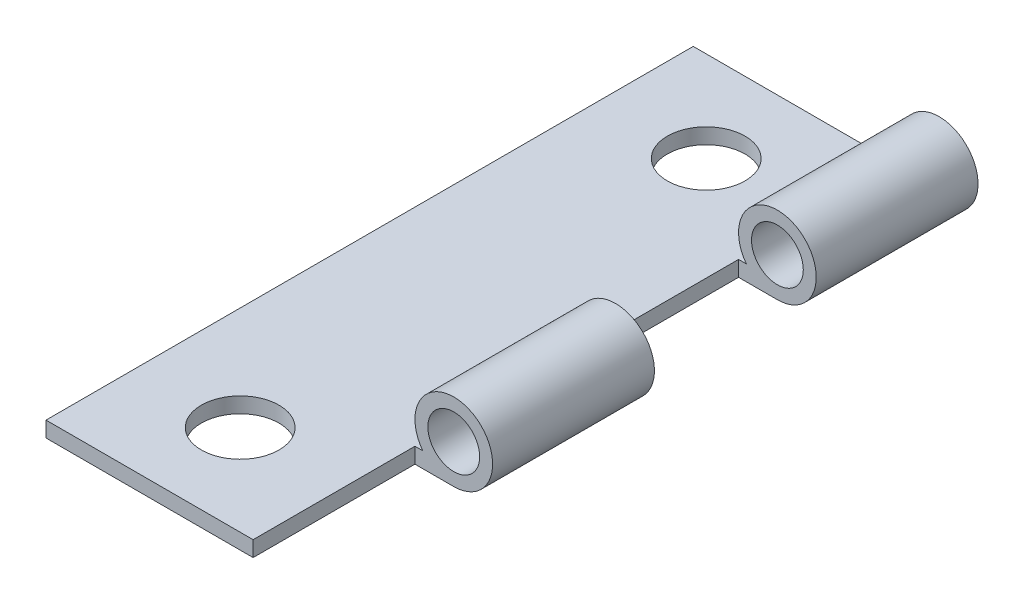
ISO-10303-21;
HEADER;
FILE_DESCRIPTION(('STEP AP214'),'2;1');
FILE_NAME('part.step','',(''),(''),'','','');
FILE_SCHEMA(('AUTOMOTIVE_DESIGN { 1 0 10303 214 1 1 1 1 }'));
ENDSEC;
DATA;
#1=APPLICATION_CONTEXT('core data for automotive mechanical design processes');
#2=APPLICATION_PROTOCOL_DEFINITION('international standard','automotive_design',2000,#1);
#3=PRODUCT_CONTEXT('',#1,'mechanical');
#4=PRODUCT('Part','Part','',(#3));
#5=PRODUCT_RELATED_PRODUCT_CATEGORY('part','',(#4));
#6=PRODUCT_DEFINITION_FORMATION('','',#4);
#7=PRODUCT_DEFINITION_CONTEXT('part definition',#1,'design');
#8=PRODUCT_DEFINITION('design','',#6,#7);
#9=PRODUCT_DEFINITION_SHAPE('','',#8);
#10=(LENGTH_UNIT() NAMED_UNIT(*) SI_UNIT(.MILLI.,.METRE.));
#11=(NAMED_UNIT(*) PLANE_ANGLE_UNIT() SI_UNIT($,.RADIAN.));
#12=(NAMED_UNIT(*) SI_UNIT($,.STERADIAN.) SOLID_ANGLE_UNIT());
#13=UNCERTAINTY_MEASURE_WITH_UNIT(LENGTH_MEASURE(1.E-05),#10,'distance_accuracy_value','');
#14=(GEOMETRIC_REPRESENTATION_CONTEXT(3) GLOBAL_UNCERTAINTY_ASSIGNED_CONTEXT((#13)) GLOBAL_UNIT_ASSIGNED_CONTEXT((#10,
#11,#12)) REPRESENTATION_CONTEXT('',''));
#15=CARTESIAN_POINT('',(0.,0.,0.));
#16=DIRECTION('',(0.,0.,1.));
#17=DIRECTION('',(1.,0.,0.));
#18=AXIS2_PLACEMENT_3D('',#15,#16,#17);
#19=CARTESIAN_POINT('',(0.,0.,12.5));
#20=DIRECTION('',(0.,0.,-1.));
#21=DIRECTION('',(-1.,0.,0.));
#22=AXIS2_PLACEMENT_3D('',#19,#20,#21);
#23=CYLINDRICAL_SURFACE('',#22,1.5);
#24=CARTESIAN_POINT('',(0.,0.,6.25));
#25=DIRECTION('',(0.,0.,1.));
#26=DIRECTION('',(1.,0.,0.));
#27=AXIS2_PLACEMENT_3D('',#24,#25,#26);
#28=CIRCLE('',#27,1.5);
#29=CARTESIAN_POINT('',(0.,-1.5,6.25));
#30=VERTEX_POINT('',#29);
#31=CARTESIAN_POINT('',(-1.2,-0.900000000000001,6.25));
#32=VERTEX_POINT('',#31);
#33=EDGE_CURVE('E140',#30,#32,#28,.T.);
#34=ORIENTED_EDGE('',*,*,#33,.F.);
#35=DIRECTION('',(0.,0.,-1.));
#36=VECTOR('',#35,1.);
#37=CARTESIAN_POINT('',(0.,-1.5,12.5));
#38=LINE('',#37,#36);
#39=CARTESIAN_POINT('',(0.,-1.5,0.));
#40=VERTEX_POINT('',#39);
#41=EDGE_CURVE('E165',#30,#40,#38,.T.);
#42=ORIENTED_EDGE('',*,*,#41,.T.);
#43=CARTESIAN_POINT('',(0.,0.,0.));
#44=DIRECTION('',(0.,0.,1.));
#45=DIRECTION('',(1.,0.,0.));
#46=AXIS2_PLACEMENT_3D('',#43,#44,#45);
#47=CIRCLE('',#46,1.5);
#48=CARTESIAN_POINT('',(-1.2,-0.900000000000001,0.));
#49=VERTEX_POINT('',#48);
#50=EDGE_CURVE('E208',#40,#49,#47,.T.);
#51=ORIENTED_EDGE('',*,*,#50,.T.);
#52=DIRECTION('',(0.,0.,-1.));
#53=VECTOR('',#52,1.);
#54=CARTESIAN_POINT('',(-1.2,-0.900000000000001,12.5));
#55=LINE('',#54,#53);
#56=EDGE_CURVE('E174',#32,#49,#55,.T.);
#57=ORIENTED_EDGE('',*,*,#56,.F.);
#58=EDGE_LOOP('',(#34,#42,#51,#57));
#59=FACE_BOUND('',#58,.T.);
#60=ADVANCED_FACE('F33',(#59),#23,.T.);
#61=CARTESIAN_POINT('',(0.,0.,-6.25));
#62=DIRECTION('',(0.,0.,1.));
#63=DIRECTION('',(1.,0.,0.));
#64=AXIS2_PLACEMENT_3D('',#61,#62,#63);
#65=CIRCLE('',#64,1.5);
#66=CARTESIAN_POINT('',(0.,-1.5,-6.25));
#67=VERTEX_POINT('',#66);
#68=CARTESIAN_POINT('',(-1.2,-0.900000000000001,-6.25));
#69=VERTEX_POINT('',#68);
#70=EDGE_CURVE('E113',#67,#69,#65,.T.);
#71=ORIENTED_EDGE('',*,*,#70,.F.);
#72=CARTESIAN_POINT('',(0.,-1.5,-12.5));
#73=VERTEX_POINT('',#72);
#74=EDGE_CURVE('E155',#67,#73,#38,.T.);
#75=ORIENTED_EDGE('',*,*,#74,.T.);
#76=CARTESIAN_POINT('',(0.,0.,-12.5));
#77=DIRECTION('',(0.,0.,1.));
#78=DIRECTION('',(1.,0.,0.));
#79=AXIS2_PLACEMENT_3D('',#76,#77,#78);
#80=CIRCLE('',#79,1.5);
#81=CARTESIAN_POINT('',(-1.2,-0.900000000000001,-12.5));
#82=VERTEX_POINT('',#81);
#83=EDGE_CURVE('E146',#73,#82,#80,.T.);
#84=ORIENTED_EDGE('',*,*,#83,.T.);
#85=EDGE_CURVE('E172',#69,#82,#55,.T.);
#86=ORIENTED_EDGE('',*,*,#85,.F.);
#87=EDGE_LOOP('',(#71,#75,#84,#86));
#88=FACE_BOUND('',#87,.T.);
#89=ADVANCED_FACE('F227',(#88),#23,.T.);
#90=CARTESIAN_POINT('',(0.,0.,12.5));
#91=DIRECTION('',(0.,0.,-1.));
#92=DIRECTION('',(-1.,0.,0.));
#93=AXIS2_PLACEMENT_3D('',#90,#91,#92);
#94=CYLINDRICAL_SURFACE('',#93,1.);
#95=CARTESIAN_POINT('',(0.,0.,-12.5));
#96=DIRECTION('',(0.,0.,1.));
#97=DIRECTION('',(1.,0.,0.));
#98=AXIS2_PLACEMENT_3D('',#95,#96,#97);
#99=CIRCLE('',#98,1.);
#100=CARTESIAN_POINT('',(1.,0.,-12.5));
#101=VERTEX_POINT('',#100);
#102=EDGE_CURVE('E138',#101,#101,#99,.T.);
#103=ORIENTED_EDGE('',*,*,#102,.F.);
#104=EDGE_LOOP('',(#103));
#105=FACE_BOUND('',#104,.T.);
#106=CARTESIAN_POINT('',(0.,0.,-6.25));
#107=DIRECTION('',(0.,0.,1.));
#108=DIRECTION('',(1.,0.,0.));
#109=AXIS2_PLACEMENT_3D('',#106,#107,#108);
#110=CIRCLE('',#109,1.);
#111=CARTESIAN_POINT('',(1.,0.,-6.25));
#112=VERTEX_POINT('',#111);
#113=EDGE_CURVE('E175',#112,#112,#110,.T.);
#114=ORIENTED_EDGE('',*,*,#113,.T.);
#115=EDGE_LOOP('',(#114));
#116=FACE_BOUND('',#115,.T.);
#117=ADVANCED_FACE('F255',(#105,#116),#94,.F.);
#118=CARTESIAN_POINT('',(0.,0.,12.5));
#119=DIRECTION('',(0.,0.,1.));
#120=DIRECTION('',(1.,0.,0.));
#121=AXIS2_PLACEMENT_3D('',#118,#119,#120);
#122=PLANE('',#121);
#123=DIRECTION('',(0.,1.,0.));
#124=VECTOR('',#123,1.);
#125=CARTESIAN_POINT('',(-1.5,-10.9,12.5));
#126=LINE('',#125,#124);
#127=CARTESIAN_POINT('',(-1.5,-1.5,12.5));
#128=VERTEX_POINT('',#127);
#129=CARTESIAN_POINT('',(-1.5,-0.900000000000001,12.5));
#130=VERTEX_POINT('',#129);
#131=EDGE_CURVE('E126',#128,#130,#126,.T.);
#132=ORIENTED_EDGE('',*,*,#131,.T.);
#133=DIRECTION('',(-1.,0.,0.));
#134=VECTOR('',#133,1.);
#135=CARTESIAN_POINT('',(-9.5,-0.900000000000001,12.5));
#136=LINE('',#135,#134);
#137=CARTESIAN_POINT('',(-9.5,-0.900000000000001,12.5));
#138=VERTEX_POINT('',#137);
#139=EDGE_CURVE('E147',#130,#138,#136,.T.);
#140=ORIENTED_EDGE('',*,*,#139,.T.);
#141=DIRECTION('',(0.,-1.,0.));
#142=VECTOR('',#141,1.);
#143=CARTESIAN_POINT('',(-9.5,-1.5,12.5));
#144=LINE('',#143,#142);
#145=CARTESIAN_POINT('',(-9.5,-1.5,12.5));
#146=VERTEX_POINT('',#145);
#147=EDGE_CURVE('E149',#138,#146,#144,.T.);
#148=ORIENTED_EDGE('',*,*,#147,.T.);
#149=DIRECTION('',(1.,0.,0.));
#150=VECTOR('',#149,1.);
#151=CARTESIAN_POINT('',(0.,-1.5,12.5));
#152=LINE('',#151,#150);
#153=EDGE_CURVE('E152',#146,#128,#152,.T.);
#154=ORIENTED_EDGE('',*,*,#153,.T.);
#155=EDGE_LOOP('',(#132,#140,#148,#154));
#156=FACE_BOUND('',#155,.T.);
#157=ADVANCED_FACE('F240',(#156),#122,.T.);
#158=CARTESIAN_POINT('',(0.,0.,-12.5));
#159=DIRECTION('',(0.,0.,1.));
#160=DIRECTION('',(1.,0.,0.));
#161=AXIS2_PLACEMENT_3D('',#158,#159,#160);
#162=PLANE('',#161);
#163=ORIENTED_EDGE('',*,*,#83,.F.);
#164=DIRECTION('',(1.,0.,0.));
#165=VECTOR('',#164,1.);
#166=CARTESIAN_POINT('',(0.,-1.5,-12.5));
#167=LINE('',#166,#165);
#168=CARTESIAN_POINT('',(-9.5,-1.5,-12.5));
#169=VERTEX_POINT('',#168);
#170=EDGE_CURVE('E150',#169,#73,#167,.T.);
#171=ORIENTED_EDGE('',*,*,#170,.F.);
#172=DIRECTION('',(0.,-1.,0.));
#173=VECTOR('',#172,1.);
#174=CARTESIAN_POINT('',(-9.5,-1.5,-12.5));
#175=LINE('',#174,#173);
#176=CARTESIAN_POINT('',(-9.5,-0.900000000000001,-12.5));
#177=VERTEX_POINT('',#176);
#178=EDGE_CURVE('E160',#177,#169,#175,.T.);
#179=ORIENTED_EDGE('',*,*,#178,.F.);
#180=DIRECTION('',(-1.,0.,0.));
#181=VECTOR('',#180,1.);
#182=CARTESIAN_POINT('',(-9.5,-0.900000000000001,-12.5));
#183=LINE('',#182,#181);
#184=EDGE_CURVE('E158',#82,#177,#183,.T.);
#185=ORIENTED_EDGE('',*,*,#184,.F.);
#186=EDGE_LOOP('',(#163,#171,#179,#185));
#187=FACE_BOUND('',#186,.T.);
#188=ORIENTED_EDGE('',*,*,#102,.T.);
#189=EDGE_LOOP('',(#188));
#190=FACE_BOUND('',#189,.T.);
#191=ADVANCED_FACE('F232',(#187,#190),#162,.F.);
#192=CARTESIAN_POINT('',(-9.5,-0.900000000000001,12.5));
#193=DIRECTION('',(0.,-1.,0.));
#194=DIRECTION('',(1.,0.,0.));
#195=AXIS2_PLACEMENT_3D('',#192,#193,#194);
#196=PLANE('',#195);
#197=CARTESIAN_POINT('',(-5.5,-0.900000000000001,-9.));
#198=DIRECTION('',(0.,1.,0.));
#199=DIRECTION('',(-1.,0.,0.));
#200=AXIS2_PLACEMENT_3D('',#197,#198,#199);
#201=CIRCLE('',#200,1.5);
#202=CARTESIAN_POINT('',(-7.,-0.900000000000001,-9.));
#203=VERTEX_POINT('',#202);
#204=EDGE_CURVE('E188',#203,#203,#201,.T.);
#205=ORIENTED_EDGE('',*,*,#204,.F.);
#206=EDGE_LOOP('',(#205));
#207=FACE_BOUND('',#206,.T.);
#208=CARTESIAN_POINT('',(-5.5,-0.900000000000001,9.));
#209=DIRECTION('',(0.,1.,0.));
#210=DIRECTION('',(-1.,0.,0.));
#211=AXIS2_PLACEMENT_3D('',#208,#209,#210);
#212=CIRCLE('',#211,1.5);
#213=CARTESIAN_POINT('',(-7.,-0.900000000000001,9.));
#214=VERTEX_POINT('',#213);
#215=EDGE_CURVE('E193',#214,#214,#212,.T.);
#216=ORIENTED_EDGE('',*,*,#215,.F.);
#217=EDGE_LOOP('',(#216));
#218=FACE_BOUND('',#217,.T.);
#219=ORIENTED_EDGE('',*,*,#139,.F.);
#220=DIRECTION('',(0.,0.,-1.));
#221=VECTOR('',#220,1.);
#222=CARTESIAN_POINT('',(-1.5,-0.900000000000001,12.5));
#223=LINE('',#222,#221);
#224=CARTESIAN_POINT('',(-1.5,-0.900000000000001,6.25));
#225=VERTEX_POINT('',#224);
#226=EDGE_CURVE('E134',#130,#225,#223,.T.);
#227=ORIENTED_EDGE('',*,*,#226,.T.);
#228=DIRECTION('',(-1.,0.,0.));
#229=VECTOR('',#228,1.);
#230=CARTESIAN_POINT('',(-9.5,-0.900000000000001,6.25));
#231=LINE('',#230,#229);
#232=EDGE_CURVE('E135',#32,#225,#231,.T.);
#233=ORIENTED_EDGE('',*,*,#232,.F.);
#234=ORIENTED_EDGE('',*,*,#56,.T.);
#235=DIRECTION('',(-1.,0.,0.));
#236=VECTOR('',#235,1.);
#237=CARTESIAN_POINT('',(-9.5,-0.900000000000001,0.));
#238=LINE('',#237,#236);
#239=CARTESIAN_POINT('',(-1.5,-0.900000000000001,0.));
#240=VERTEX_POINT('',#239);
#241=EDGE_CURVE('E133',#49,#240,#238,.T.);
#242=ORIENTED_EDGE('',*,*,#241,.T.);
#243=DIRECTION('',(0.,0.,-1.));
#244=VECTOR('',#243,1.);
#245=CARTESIAN_POINT('',(-1.5,-0.900000000000001,12.5));
#246=LINE('',#245,#244);
#247=CARTESIAN_POINT('',(-1.5,-0.900000000000001,-6.25));
#248=VERTEX_POINT('',#247);
#249=EDGE_CURVE('E122',#240,#248,#246,.T.);
#250=ORIENTED_EDGE('',*,*,#249,.T.);
#251=DIRECTION('',(-1.,0.,0.));
#252=VECTOR('',#251,1.);
#253=CARTESIAN_POINT('',(-9.5,-0.900000000000001,-6.25));
#254=LINE('',#253,#252);
#255=EDGE_CURVE('E111',#69,#248,#254,.T.);
#256=ORIENTED_EDGE('',*,*,#255,.F.);
#257=ORIENTED_EDGE('',*,*,#85,.T.);
#258=ORIENTED_EDGE('',*,*,#184,.T.);
#259=DIRECTION('',(0.,0.,-1.));
#260=VECTOR('',#259,1.);
#261=CARTESIAN_POINT('',(-9.5,-0.900000000000001,12.5));
#262=LINE('',#261,#260);
#263=EDGE_CURVE('E169',#138,#177,#262,.T.);
#264=ORIENTED_EDGE('',*,*,#263,.F.);
#265=EDGE_LOOP('',(#219,#227,#233,#234,#242,#250,#256,#257,#258,#264));
#266=FACE_BOUND('',#265,.T.);
#267=ADVANCED_FACE('F131',(#207,#218,#266),#196,.F.);
#268=CARTESIAN_POINT('',(-9.5,-1.5,12.5));
#269=DIRECTION('',(1.,0.,0.));
#270=DIRECTION('',(0.,0.,-1.));
#271=AXIS2_PLACEMENT_3D('',#268,#269,#270);
#272=PLANE('',#271);
#273=ORIENTED_EDGE('',*,*,#178,.T.);
#274=DIRECTION('',(0.,0.,-1.));
#275=VECTOR('',#274,1.);
#276=CARTESIAN_POINT('',(-9.5,-1.5,12.5));
#277=LINE('',#276,#275);
#278=EDGE_CURVE('E166',#146,#169,#277,.T.);
#279=ORIENTED_EDGE('',*,*,#278,.F.);
#280=ORIENTED_EDGE('',*,*,#147,.F.);
#281=ORIENTED_EDGE('',*,*,#263,.T.);
#282=EDGE_LOOP('',(#273,#279,#280,#281));
#283=FACE_BOUND('',#282,.T.);
#284=ADVANCED_FACE('F236',(#283),#272,.F.);
#285=CARTESIAN_POINT('',(0.,-1.5,12.5));
#286=DIRECTION('',(0.,1.,0.));
#287=DIRECTION('',(-1.,0.,0.));
#288=AXIS2_PLACEMENT_3D('',#285,#286,#287);
#289=PLANE('',#288);
#290=CARTESIAN_POINT('',(-5.5,-1.5,-9.));
#291=DIRECTION('',(0.,1.,0.));
#292=DIRECTION('',(-1.,0.,0.));
#293=AXIS2_PLACEMENT_3D('',#290,#291,#292);
#294=CIRCLE('',#293,1.5);
#295=CARTESIAN_POINT('',(-7.,-1.5,-9.));
#296=VERTEX_POINT('',#295);
#297=EDGE_CURVE('E36',#296,#296,#294,.T.);
#298=ORIENTED_EDGE('',*,*,#297,.T.);
#299=EDGE_LOOP('',(#298));
#300=FACE_BOUND('',#299,.T.);
#301=CARTESIAN_POINT('',(-5.5,-1.5,9.));
#302=DIRECTION('',(0.,1.,0.));
#303=DIRECTION('',(-1.,0.,0.));
#304=AXIS2_PLACEMENT_3D('',#301,#302,#303);
#305=CIRCLE('',#304,1.5);
#306=CARTESIAN_POINT('',(-7.,-1.5,9.));
#307=VERTEX_POINT('',#306);
#308=EDGE_CURVE('E186',#307,#307,#305,.T.);
#309=ORIENTED_EDGE('',*,*,#308,.T.);
#310=EDGE_LOOP('',(#309));
#311=FACE_BOUND('',#310,.T.);
#312=DIRECTION('',(1.,0.,0.));
#313=VECTOR('',#312,1.);
#314=CARTESIAN_POINT('',(0.,-1.5,6.25));
#315=LINE('',#314,#313);
#316=CARTESIAN_POINT('',(-1.5,-1.5,6.25));
#317=VERTEX_POINT('',#316);
#318=EDGE_CURVE('E185',#317,#30,#315,.T.);
#319=ORIENTED_EDGE('',*,*,#318,.F.);
#320=DIRECTION('',(0.,0.,1.));
#321=VECTOR('',#320,1.);
#322=CARTESIAN_POINT('',(-1.5,-1.5,12.5));
#323=LINE('',#322,#321);
#324=EDGE_CURVE('E11',#317,#128,#323,.T.);
#325=ORIENTED_EDGE('',*,*,#324,.T.);
#326=ORIENTED_EDGE('',*,*,#153,.F.);
#327=ORIENTED_EDGE('',*,*,#278,.T.);
#328=ORIENTED_EDGE('',*,*,#170,.T.);
#329=ORIENTED_EDGE('',*,*,#74,.F.);
#330=DIRECTION('',(1.,0.,0.));
#331=VECTOR('',#330,1.);
#332=CARTESIAN_POINT('',(0.,-1.5,-6.25));
#333=LINE('',#332,#331);
#334=CARTESIAN_POINT('',(-1.5,-1.5,-6.25));
#335=VERTEX_POINT('',#334);
#336=EDGE_CURVE('E178',#335,#67,#333,.T.);
#337=ORIENTED_EDGE('',*,*,#336,.F.);
#338=DIRECTION('',(0.,0.,1.));
#339=VECTOR('',#338,1.);
#340=CARTESIAN_POINT('',(-1.5,-1.5,12.5));
#341=LINE('',#340,#339);
#342=CARTESIAN_POINT('',(-1.5,-1.5,0.));
#343=VERTEX_POINT('',#342);
#344=EDGE_CURVE('E41',#335,#343,#341,.T.);
#345=ORIENTED_EDGE('',*,*,#344,.T.);
#346=DIRECTION('',(1.,0.,0.));
#347=VECTOR('',#346,1.);
#348=CARTESIAN_POINT('',(0.,-1.5,0.));
#349=LINE('',#348,#347);
#350=EDGE_CURVE('E181',#343,#40,#349,.T.);
#351=ORIENTED_EDGE('',*,*,#350,.T.);
#352=ORIENTED_EDGE('',*,*,#41,.F.);
#353=EDGE_LOOP('',(#319,#325,#326,#327,#328,#329,#337,#345,#351,#352));
#354=FACE_BOUND('',#353,.T.);
#355=ADVANCED_FACE('F222',(#300,#311,#354),#289,.F.);
#356=CARTESIAN_POINT('',(-1.5,-10.9,-6.25));
#357=DIRECTION('',(-1.,0.,0.));
#358=DIRECTION('',(0.,0.,1.));
#359=AXIS2_PLACEMENT_3D('',#356,#357,#358);
#360=PLANE('',#359);
#361=DIRECTION('',(0.,1.,0.));
#362=VECTOR('',#361,1.);
#363=CARTESIAN_POINT('',(-1.5,-10.9,0.));
#364=LINE('',#363,#362);
#365=EDGE_CURVE('E127',#343,#240,#364,.T.);
#366=ORIENTED_EDGE('',*,*,#365,.F.);
#367=ORIENTED_EDGE('',*,*,#344,.F.);
#368=DIRECTION('',(0.,1.,0.));
#369=VECTOR('',#368,1.);
#370=CARTESIAN_POINT('',(-1.5,-10.9,-6.25));
#371=LINE('',#370,#369);
#372=EDGE_CURVE('E57',#335,#248,#371,.T.);
#373=ORIENTED_EDGE('',*,*,#372,.T.);
#374=ORIENTED_EDGE('',*,*,#249,.F.);
#375=EDGE_LOOP('',(#366,#367,#373,#374));
#376=FACE_BOUND('',#375,.T.);
#377=ADVANCED_FACE('F121',(#376),#360,.F.);
#378=CARTESIAN_POINT('',(-1.5,-10.9,0.));
#379=DIRECTION('',(0.,0.,1.));
#380=DIRECTION('',(1.,0.,0.));
#381=AXIS2_PLACEMENT_3D('',#378,#379,#380);
#382=PLANE('',#381);
#383=CARTESIAN_POINT('',(0.,0.,0.));
#384=DIRECTION('',(0.,0.,1.));
#385=DIRECTION('',(1.,0.,0.));
#386=AXIS2_PLACEMENT_3D('',#383,#384,#385);
#387=CIRCLE('',#386,1.);
#388=CARTESIAN_POINT('',(1.,0.,0.));
#389=VERTEX_POINT('',#388);
#390=EDGE_CURVE('E117',#389,#389,#387,.T.);
#391=ORIENTED_EDGE('',*,*,#390,.T.);
#392=EDGE_LOOP('',(#391));
#393=FACE_BOUND('',#392,.T.);
#394=ORIENTED_EDGE('',*,*,#50,.F.);
#395=ORIENTED_EDGE('',*,*,#350,.F.);
#396=ORIENTED_EDGE('',*,*,#365,.T.);
#397=ORIENTED_EDGE('',*,*,#241,.F.);
#398=EDGE_LOOP('',(#394,#395,#396,#397));
#399=FACE_BOUND('',#398,.T.);
#400=ADVANCED_FACE('F220',(#393,#399),#382,.F.);
#401=CARTESIAN_POINT('',(-1.5,-10.9,-6.25));
#402=DIRECTION('',(0.,0.,1.));
#403=DIRECTION('',(1.,0.,0.));
#404=AXIS2_PLACEMENT_3D('',#401,#402,#403);
#405=PLANE('',#404);
#406=ORIENTED_EDGE('',*,*,#113,.F.);
#407=EDGE_LOOP('',(#406));
#408=FACE_BOUND('',#407,.T.);
#409=ORIENTED_EDGE('',*,*,#255,.T.);
#410=ORIENTED_EDGE('',*,*,#372,.F.);
#411=ORIENTED_EDGE('',*,*,#336,.T.);
#412=ORIENTED_EDGE('',*,*,#70,.T.);
#413=EDGE_LOOP('',(#409,#410,#411,#412));
#414=FACE_BOUND('',#413,.T.);
#415=ADVANCED_FACE('F112',(#408,#414),#405,.T.);
#416=ORIENTED_EDGE('',*,*,#390,.F.);
#417=EDGE_LOOP('',(#416));
#418=FACE_BOUND('',#417,.T.);
#419=CARTESIAN_POINT('',(0.,0.,6.25));
#420=DIRECTION('',(0.,0.,1.));
#421=DIRECTION('',(1.,0.,0.));
#422=AXIS2_PLACEMENT_3D('',#419,#420,#421);
#423=CIRCLE('',#422,1.);
#424=CARTESIAN_POINT('',(1.,0.,6.25));
#425=VERTEX_POINT('',#424);
#426=EDGE_CURVE('E182',#425,#425,#423,.T.);
#427=ORIENTED_EDGE('',*,*,#426,.T.);
#428=EDGE_LOOP('',(#427));
#429=FACE_BOUND('',#428,.T.);
#430=ADVANCED_FACE('F244',(#418,#429),#94,.F.);
#431=CARTESIAN_POINT('',(-1.5,-10.9,6.25));
#432=DIRECTION('',(-1.,0.,0.));
#433=DIRECTION('',(0.,0.,1.));
#434=AXIS2_PLACEMENT_3D('',#431,#432,#433);
#435=PLANE('',#434);
#436=ORIENTED_EDGE('',*,*,#131,.F.);
#437=ORIENTED_EDGE('',*,*,#324,.F.);
#438=DIRECTION('',(0.,1.,0.));
#439=VECTOR('',#438,1.);
#440=CARTESIAN_POINT('',(-1.5,-10.9,6.25));
#441=LINE('',#440,#439);
#442=EDGE_CURVE('E49',#317,#225,#441,.T.);
#443=ORIENTED_EDGE('',*,*,#442,.T.);
#444=ORIENTED_EDGE('',*,*,#226,.F.);
#445=EDGE_LOOP('',(#436,#437,#443,#444));
#446=FACE_BOUND('',#445,.T.);
#447=ADVANCED_FACE('F242',(#446),#435,.F.);
#448=CARTESIAN_POINT('',(-1.5,-10.9,6.25));
#449=DIRECTION('',(0.,0.,1.));
#450=DIRECTION('',(1.,0.,0.));
#451=AXIS2_PLACEMENT_3D('',#448,#449,#450);
#452=PLANE('',#451);
#453=ORIENTED_EDGE('',*,*,#426,.F.);
#454=EDGE_LOOP('',(#453));
#455=FACE_BOUND('',#454,.T.);
#456=ORIENTED_EDGE('',*,*,#232,.T.);
#457=ORIENTED_EDGE('',*,*,#442,.F.);
#458=ORIENTED_EDGE('',*,*,#318,.T.);
#459=ORIENTED_EDGE('',*,*,#33,.T.);
#460=EDGE_LOOP('',(#456,#457,#458,#459));
#461=FACE_BOUND('',#460,.T.);
#462=ADVANCED_FACE('F213',(#455,#461),#452,.T.);
#463=CARTESIAN_POINT('',(-5.5,-10.9,9.));
#464=DIRECTION('',(0.,1.,0.));
#465=DIRECTION('',(-1.,0.,0.));
#466=AXIS2_PLACEMENT_3D('',#463,#464,#465);
#467=CYLINDRICAL_SURFACE('',#466,1.5);
#468=ORIENTED_EDGE('',*,*,#215,.T.);
#469=EDGE_LOOP('',(#468));
#470=FACE_BOUND('',#469,.T.);
#471=ORIENTED_EDGE('',*,*,#308,.F.);
#472=EDGE_LOOP('',(#471));
#473=FACE_BOUND('',#472,.T.);
#474=ADVANCED_FACE('F250',(#470,#473),#467,.F.);
#475=CARTESIAN_POINT('',(-5.5,-10.9,-9.));
#476=DIRECTION('',(0.,1.,0.));
#477=DIRECTION('',(-1.,0.,0.));
#478=AXIS2_PLACEMENT_3D('',#475,#476,#477);
#479=CYLINDRICAL_SURFACE('',#478,1.5);
#480=ORIENTED_EDGE('',*,*,#204,.T.);
#481=EDGE_LOOP('',(#480));
#482=FACE_BOUND('',#481,.T.);
#483=ORIENTED_EDGE('',*,*,#297,.F.);
#484=EDGE_LOOP('',(#483));
#485=FACE_BOUND('',#484,.T.);
#486=ADVANCED_FACE('F290',(#482,#485),#479,.F.);
#487=CLOSED_SHELL('',(#60,#89,#117,#157,#191,#267,#284,#355,#377,#400,#415,#430,#447,#462,#474,#486));
#488=MANIFOLD_SOLID_BREP('B2',#487);
#489=ADVANCED_BREP_SHAPE_REPRESENTATION('',(#18,#488),#14);
#490=SHAPE_DEFINITION_REPRESENTATION(#9,#489);
ENDSEC;
END-ISO-10303-21;
